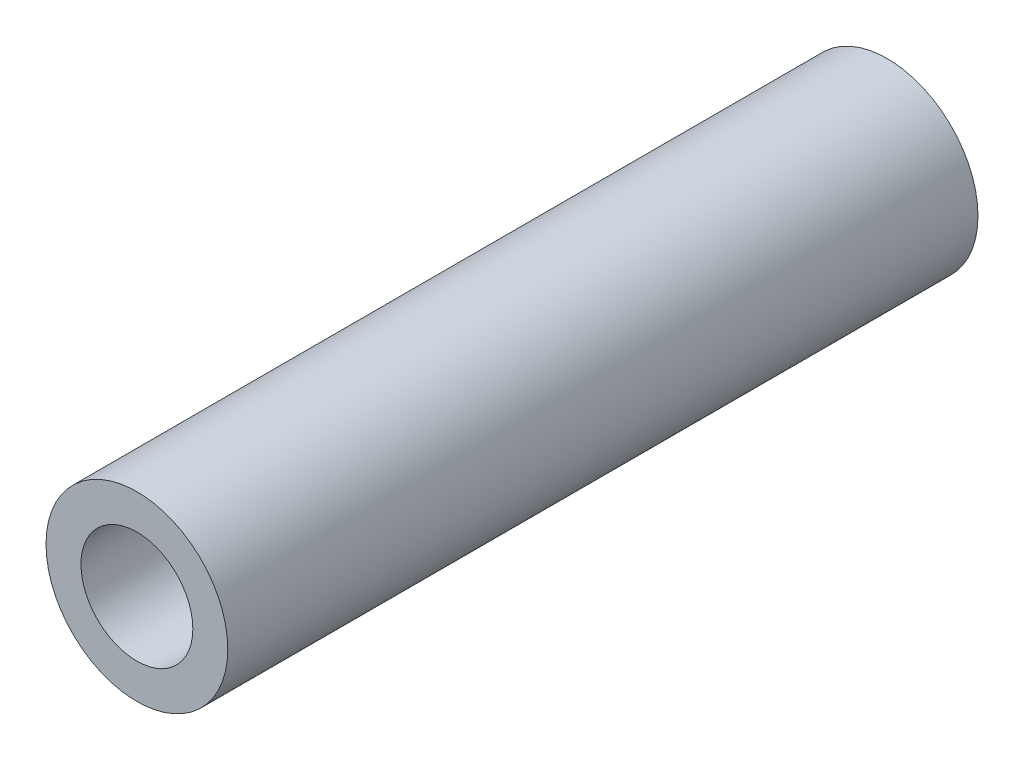
ISO-10303-21;
HEADER;
FILE_DESCRIPTION(('STEP AP214'),'2;1');
FILE_NAME('part.step','',(''),(''),'','','');
FILE_SCHEMA(('AUTOMOTIVE_DESIGN { 1 0 10303 214 1 1 1 1 }'));
ENDSEC;
DATA;
#1=APPLICATION_CONTEXT('core data for automotive mechanical design processes');
#2=APPLICATION_PROTOCOL_DEFINITION('international standard','automotive_design',2000,#1);
#3=PRODUCT_CONTEXT('',#1,'mechanical');
#4=PRODUCT('Part','Part','',(#3));
#5=PRODUCT_RELATED_PRODUCT_CATEGORY('part','',(#4));
#6=PRODUCT_DEFINITION_FORMATION('','',#4);
#7=PRODUCT_DEFINITION_CONTEXT('part definition',#1,'design');
#8=PRODUCT_DEFINITION('design','',#6,#7);
#9=PRODUCT_DEFINITION_SHAPE('','',#8);
#10=(LENGTH_UNIT() NAMED_UNIT(*) SI_UNIT(.MILLI.,.METRE.));
#11=(NAMED_UNIT(*) PLANE_ANGLE_UNIT() SI_UNIT($,.RADIAN.));
#12=(NAMED_UNIT(*) SI_UNIT($,.STERADIAN.) SOLID_ANGLE_UNIT());
#13=UNCERTAINTY_MEASURE_WITH_UNIT(LENGTH_MEASURE(1.E-05),#10,'distance_accuracy_value','');
#14=(GEOMETRIC_REPRESENTATION_CONTEXT(3) GLOBAL_UNCERTAINTY_ASSIGNED_CONTEXT((#13)) GLOBAL_UNIT_ASSIGNED_CONTEXT((#10,
#11,#12)) REPRESENTATION_CONTEXT('',''));
#15=CARTESIAN_POINT('',(0.,0.,0.));
#16=DIRECTION('',(0.,0.,1.));
#17=DIRECTION('',(1.,0.,0.));
#18=AXIS2_PLACEMENT_3D('',#15,#16,#17);
#19=CARTESIAN_POINT('',(106.65354330707,-7.33009453659882E-13,72.0347763108508));
#20=DIRECTION('',(0.,0.,-1.));
#21=DIRECTION('',(-1.,0.,0.));
#22=AXIS2_PLACEMENT_3D('',#19,#20,#21);
#23=CYLINDRICAL_SURFACE('',#22,6.5);
#24=CARTESIAN_POINT('',(106.65354330707,-7.33009453659882E-13,0.));
#25=DIRECTION('',(0.,0.,1.));
#26=DIRECTION('',(1.,0.,0.));
#27=AXIS2_PLACEMENT_3D('',#24,#25,#26);
#28=CIRCLE('',#27,6.5);
#29=CARTESIAN_POINT('',(113.15354330707,-7.33009453659882E-13,0.));
#30=VERTEX_POINT('',#29);
#31=EDGE_CURVE('E40',#30,#30,#28,.T.);
#32=ORIENTED_EDGE('',*,*,#31,.T.);
#33=EDGE_LOOP('',(#32));
#34=FACE_BOUND('',#33,.T.);
#35=CARTESIAN_POINT('',(106.65354330707,-7.33009453659882E-13,53.6500000000006));
#36=DIRECTION('',(0.,0.,1.));
#37=DIRECTION('',(1.,0.,0.));
#38=AXIS2_PLACEMENT_3D('',#35,#36,#37);
#39=CIRCLE('',#38,6.5);
#40=CARTESIAN_POINT('',(113.15354330707,-7.33009453659882E-13,53.6500000000006));
#41=VERTEX_POINT('',#40);
#42=EDGE_CURVE('E10',#41,#41,#39,.T.);
#43=ORIENTED_EDGE('',*,*,#42,.F.);
#44=EDGE_LOOP('',(#43));
#45=FACE_BOUND('',#44,.T.);
#46=ADVANCED_FACE('F33',(#34,#45),#23,.T.);
#47=CARTESIAN_POINT('',(106.65354330707,-7.33009453659882E-13,0.));
#48=DIRECTION('',(0.,0.,1.));
#49=DIRECTION('',(1.,0.,0.));
#50=AXIS2_PLACEMENT_3D('',#47,#48,#49);
#51=PLANE('',#50);
#52=ORIENTED_EDGE('',*,*,#31,.F.);
#53=EDGE_LOOP('',(#52));
#54=FACE_BOUND('',#53,.T.);
#55=CARTESIAN_POINT('',(106.65354330707,-7.33009453659882E-13,0.));
#56=DIRECTION('',(0.,0.,1.));
#57=DIRECTION('',(1.,0.,0.));
#58=AXIS2_PLACEMENT_3D('',#55,#56,#57);
#59=CIRCLE('',#58,4.00000000000001);
#60=CARTESIAN_POINT('',(110.65354330707,-7.33009453659882E-13,0.));
#61=VERTEX_POINT('',#60);
#62=EDGE_CURVE('E45',#61,#61,#59,.T.);
#63=ORIENTED_EDGE('',*,*,#62,.T.);
#64=EDGE_LOOP('',(#63));
#65=FACE_BOUND('',#64,.T.);
#66=ADVANCED_FACE('F61',(#54,#65),#51,.F.);
#67=CARTESIAN_POINT('',(106.65354330707,-7.33009453659882E-13,72.0347763108508));
#68=DIRECTION('',(0.,0.,-1.));
#69=DIRECTION('',(-1.,0.,0.));
#70=AXIS2_PLACEMENT_3D('',#67,#68,#69);
#71=CYLINDRICAL_SURFACE('',#70,4.00000000000001);
#72=ORIENTED_EDGE('',*,*,#62,.F.);
#73=EDGE_LOOP('',(#72));
#74=FACE_BOUND('',#73,.T.);
#75=CARTESIAN_POINT('',(106.65354330707,-7.33009453659882E-13,53.6500000000006));
#76=DIRECTION('',(0.,0.,1.));
#77=DIRECTION('',(1.,0.,0.));
#78=AXIS2_PLACEMENT_3D('',#75,#76,#77);
#79=CIRCLE('',#78,4.00000000000001);
#80=CARTESIAN_POINT('',(110.65354330707,-7.33009453659882E-13,53.6500000000006));
#81=VERTEX_POINT('',#80);
#82=EDGE_CURVE('E36',#81,#81,#79,.T.);
#83=ORIENTED_EDGE('',*,*,#82,.T.);
#84=EDGE_LOOP('',(#83));
#85=FACE_BOUND('',#84,.T.);
#86=ADVANCED_FACE('F53',(#74,#85),#71,.F.);
#87=CARTESIAN_POINT('',(1.36002320516582E-12,3.44169137633799E-12,53.6500000000006));
#88=DIRECTION('',(0.,0.,1.));
#89=DIRECTION('',(-1.,0.,0.));
#90=AXIS2_PLACEMENT_3D('',#87,#88,#89);
#91=PLANE('',#90);
#92=ORIENTED_EDGE('',*,*,#82,.F.);
#93=EDGE_LOOP('',(#92));
#94=FACE_BOUND('',#93,.T.);
#95=ORIENTED_EDGE('',*,*,#42,.T.);
#96=EDGE_LOOP('',(#95));
#97=FACE_BOUND('',#96,.T.);
#98=ADVANCED_FACE('F55',(#94,#97),#91,.T.);
#99=CLOSED_SHELL('',(#46,#66,#86,#98));
#100=MANIFOLD_SOLID_BREP('B2',#99);
#101=ADVANCED_BREP_SHAPE_REPRESENTATION('',(#18,#100),#14);
#102=SHAPE_DEFINITION_REPRESENTATION(#9,#101);
ENDSEC;
END-ISO-10303-21;
